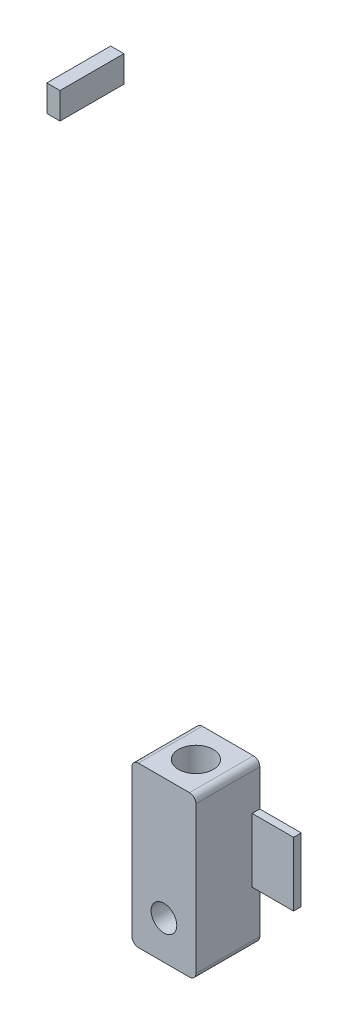
ISO-10303-21;
HEADER;
FILE_DESCRIPTION(('STEP AP214'),'2;1');
FILE_NAME('part.step','',(''),(''),'','','');
FILE_SCHEMA(('AUTOMOTIVE_DESIGN { 1 0 10303 214 1 1 1 1 }'));
ENDSEC;
DATA;
#1=APPLICATION_CONTEXT('core data for automotive mechanical design processes');
#2=APPLICATION_PROTOCOL_DEFINITION('international standard','automotive_design',2000,#1);
#3=PRODUCT_CONTEXT('',#1,'mechanical');
#4=PRODUCT('Part','Part','',(#3));
#5=PRODUCT_RELATED_PRODUCT_CATEGORY('part','',(#4));
#6=PRODUCT_DEFINITION_FORMATION('','',#4);
#7=PRODUCT_DEFINITION_CONTEXT('part definition',#1,'design');
#8=PRODUCT_DEFINITION('design','',#6,#7);
#9=PRODUCT_DEFINITION_SHAPE('','',#8);
#10=(LENGTH_UNIT() NAMED_UNIT(*) SI_UNIT(.MILLI.,.METRE.));
#11=(NAMED_UNIT(*) PLANE_ANGLE_UNIT() SI_UNIT($,.RADIAN.));
#12=(NAMED_UNIT(*) SI_UNIT($,.STERADIAN.) SOLID_ANGLE_UNIT());
#13=UNCERTAINTY_MEASURE_WITH_UNIT(LENGTH_MEASURE(1.E-05),#10,'distance_accuracy_value','');
#14=(GEOMETRIC_REPRESENTATION_CONTEXT(3) GLOBAL_UNCERTAINTY_ASSIGNED_CONTEXT((#13)) GLOBAL_UNIT_ASSIGNED_CONTEXT((#10,
#11,#12)) REPRESENTATION_CONTEXT('',''));
#15=CARTESIAN_POINT('',(0.,0.,0.));
#16=DIRECTION('',(0.,0.,1.));
#17=DIRECTION('',(1.,0.,0.));
#18=AXIS2_PLACEMENT_3D('',#15,#16,#17);
#19=CARTESIAN_POINT('',(-23.2833333333333,123.825,12.2306060509148));
#20=DIRECTION('',(-1.,0.,0.));
#21=DIRECTION('',(0.,-1.,0.));
#22=AXIS2_PLACEMENT_3D('',#19,#20,#21);
#23=PLANE('',#22);
#24=DIRECTION('',(0.,-1.,0.));
#25=VECTOR('',#24,1.);
#26=CARTESIAN_POINT('',(-23.2833333333333,123.825,6.35));
#27=LINE('',#26,#25);
#28=CARTESIAN_POINT('',(-23.2833333333333,123.825,6.35));
#29=VERTEX_POINT('',#28);
#30=CARTESIAN_POINT('',(-23.2833333333333,118.565226048503,6.35));
#31=VERTEX_POINT('',#30);
#32=EDGE_CURVE('E57',#29,#31,#27,.T.);
#33=ORIENTED_EDGE('',*,*,#32,.F.);
#34=DIRECTION('',(0.,0.,-1.));
#35=VECTOR('',#34,1.);
#36=CARTESIAN_POINT('',(-23.2833333333333,123.825,12.2306060509148));
#37=LINE('',#36,#35);
#38=CARTESIAN_POINT('',(-23.2833333333333,123.825,-6.35));
#39=VERTEX_POINT('',#38);
#40=EDGE_CURVE('E85',#29,#39,#37,.T.);
#41=ORIENTED_EDGE('',*,*,#40,.T.);
#42=DIRECTION('',(0.,1.,0.));
#43=VECTOR('',#42,1.);
#44=CARTESIAN_POINT('',(-23.2833333333333,123.825,-6.35));
#45=LINE('',#44,#43);
#46=CARTESIAN_POINT('',(-23.2833333333333,118.565226048503,-6.35));
#47=VERTEX_POINT('',#46);
#48=EDGE_CURVE('E89',#47,#39,#45,.T.);
#49=ORIENTED_EDGE('',*,*,#48,.F.);
#50=DIRECTION('',(0.,0.,-1.));
#51=VECTOR('',#50,1.);
#52=CARTESIAN_POINT('',(-23.2833333333333,118.565226048503,12.2306060509148));
#53=LINE('',#52,#51);
#54=EDGE_CURVE('E111',#31,#47,#53,.T.);
#55=ORIENTED_EDGE('',*,*,#54,.F.);
#56=EDGE_LOOP('',(#33,#41,#49,#55));
#57=FACE_BOUND('',#56,.T.);
#58=ADVANCED_FACE('F49',(#57),#23,.T.);
#59=CARTESIAN_POINT('',(-23.2833333333333,118.565226048503,12.2306060509148));
#60=DIRECTION('',(0.,-1.,0.));
#61=DIRECTION('',(1.,0.,0.));
#62=AXIS2_PLACEMENT_3D('',#59,#60,#61);
#63=PLANE('',#62);
#64=DIRECTION('',(1.,0.,0.));
#65=VECTOR('',#64,1.);
#66=CARTESIAN_POINT('',(-23.2833333333333,118.565226048503,6.35));
#67=LINE('',#66,#65);
#68=CARTESIAN_POINT('',(-20.6534463575849,118.565226048503,6.35));
#69=VERTEX_POINT('',#68);
#70=EDGE_CURVE('E63',#31,#69,#67,.T.);
#71=ORIENTED_EDGE('',*,*,#70,.F.);
#72=ORIENTED_EDGE('',*,*,#54,.T.);
#73=DIRECTION('',(-1.,0.,0.));
#74=VECTOR('',#73,1.);
#75=CARTESIAN_POINT('',(-23.2833333333333,118.565226048503,-6.35));
#76=LINE('',#75,#74);
#77=CARTESIAN_POINT('',(-20.6534463575849,118.565226048503,-6.35));
#78=VERTEX_POINT('',#77);
#79=EDGE_CURVE('E94',#78,#47,#76,.T.);
#80=ORIENTED_EDGE('',*,*,#79,.F.);
#81=DIRECTION('',(0.,0.,-1.));
#82=VECTOR('',#81,1.);
#83=CARTESIAN_POINT('',(-20.6534463575849,118.565226048503,12.2306060509148));
#84=LINE('',#83,#82);
#85=EDGE_CURVE('E114',#69,#78,#84,.T.);
#86=ORIENTED_EDGE('',*,*,#85,.F.);
#87=EDGE_LOOP('',(#71,#72,#80,#86));
#88=FACE_BOUND('',#87,.T.);
#89=ADVANCED_FACE('F120',(#88),#63,.T.);
#90=CARTESIAN_POINT('',(-20.6534463575849,123.825,12.2306060509148));
#91=DIRECTION('',(1.,0.,0.));
#92=DIRECTION('',(0.,0.,-1.));
#93=AXIS2_PLACEMENT_3D('',#90,#91,#92);
#94=PLANE('',#93);
#95=DIRECTION('',(0.,1.,0.));
#96=VECTOR('',#95,1.);
#97=CARTESIAN_POINT('',(-20.6534463575849,123.825,6.35));
#98=LINE('',#97,#96);
#99=CARTESIAN_POINT('',(-20.6534463575849,123.825,6.35));
#100=VERTEX_POINT('',#99);
#101=EDGE_CURVE('E113',#69,#100,#98,.T.);
#102=ORIENTED_EDGE('',*,*,#101,.F.);
#103=ORIENTED_EDGE('',*,*,#85,.T.);
#104=DIRECTION('',(0.,-1.,0.));
#105=VECTOR('',#104,1.);
#106=CARTESIAN_POINT('',(-20.6534463575849,123.825,-6.35));
#107=LINE('',#106,#105);
#108=CARTESIAN_POINT('',(-20.6534463575849,123.825,-6.35));
#109=VERTEX_POINT('',#108);
#110=EDGE_CURVE('E102',#109,#78,#107,.T.);
#111=ORIENTED_EDGE('',*,*,#110,.F.);
#112=DIRECTION('',(0.,0.,-1.));
#113=VECTOR('',#112,1.);
#114=CARTESIAN_POINT('',(-20.6534463575849,123.825,12.2306060509148));
#115=LINE('',#114,#113);
#116=EDGE_CURVE('E93',#100,#109,#115,.T.);
#117=ORIENTED_EDGE('',*,*,#116,.F.);
#118=EDGE_LOOP('',(#102,#103,#111,#117));
#119=FACE_BOUND('',#118,.T.);
#120=ADVANCED_FACE('F118',(#119),#94,.T.);
#121=CARTESIAN_POINT('',(-23.2833333333333,123.825,12.2306060509148));
#122=DIRECTION('',(0.,1.,0.));
#123=DIRECTION('',(0.,0.,1.));
#124=AXIS2_PLACEMENT_3D('',#121,#122,#123);
#125=PLANE('',#124);
#126=DIRECTION('',(-1.,0.,0.));
#127=VECTOR('',#126,1.);
#128=CARTESIAN_POINT('',(-23.2833333333333,123.825,6.35));
#129=LINE('',#128,#127);
#130=EDGE_CURVE('E13',#100,#29,#129,.T.);
#131=ORIENTED_EDGE('',*,*,#130,.F.);
#132=ORIENTED_EDGE('',*,*,#116,.T.);
#133=DIRECTION('',(1.,0.,0.));
#134=VECTOR('',#133,1.);
#135=CARTESIAN_POINT('',(-23.2833333333333,123.825,-6.35));
#136=LINE('',#135,#134);
#137=EDGE_CURVE('E96',#39,#109,#136,.T.);
#138=ORIENTED_EDGE('',*,*,#137,.F.);
#139=ORIENTED_EDGE('',*,*,#40,.F.);
#140=EDGE_LOOP('',(#131,#132,#138,#139));
#141=FACE_BOUND('',#140,.T.);
#142=ADVANCED_FACE('F97',(#141),#125,.T.);
#143=CARTESIAN_POINT('',(0.,0.,-6.35));
#144=DIRECTION('',(0.,0.,1.));
#145=DIRECTION('',(1.,0.,0.));
#146=AXIS2_PLACEMENT_3D('',#143,#144,#145);
#147=PLANE('',#146);
#148=ORIENTED_EDGE('',*,*,#48,.T.);
#149=ORIENTED_EDGE('',*,*,#137,.T.);
#150=ORIENTED_EDGE('',*,*,#110,.T.);
#151=ORIENTED_EDGE('',*,*,#79,.T.);
#152=EDGE_LOOP('',(#148,#149,#150,#151));
#153=FACE_BOUND('',#152,.T.);
#154=ADVANCED_FACE('F104',(#153),#147,.F.);
#155=CARTESIAN_POINT('',(6.35,-15.875,6.35));
#156=DIRECTION('',(0.,0.,-1.));
#157=DIRECTION('',(-1.,0.,0.));
#158=AXIS2_PLACEMENT_3D('',#155,#156,#157);
#159=PLANE('',#158);
#160=ORIENTED_EDGE('',*,*,#32,.T.);
#161=ORIENTED_EDGE('',*,*,#70,.T.);
#162=ORIENTED_EDGE('',*,*,#101,.T.);
#163=ORIENTED_EDGE('',*,*,#130,.T.);
#164=EDGE_LOOP('',(#160,#161,#162,#163));
#165=FACE_BOUND('',#164,.T.);
#166=ADVANCED_FACE('F123',(#165),#159,.F.);
#167=CLOSED_SHELL('',(#58,#89,#120,#142,#154,#166));
#168=MANIFOLD_SOLID_BREP('B2',#167);
#169=CARTESIAN_POINT('',(6.35,0.,0.));
#170=DIRECTION('',(-1.,0.,0.));
#171=DIRECTION('',(0.,0.,1.));
#172=AXIS2_PLACEMENT_3D('',#169,#170,#171);
#173=PLANE('',#172);
#174=DIRECTION('',(0.,1.,0.));
#175=VECTOR('',#174,1.);
#176=CARTESIAN_POINT('',(6.35,-15.875,-6.35));
#177=LINE('',#176,#175);
#178=CARTESIAN_POINT('',(6.35,7.34826693936459,-6.35));
#179=VERTEX_POINT('',#178);
#180=CARTESIAN_POINT('',(6.35,14.605,-6.35));
#181=VERTEX_POINT('',#180);
#182=EDGE_CURVE('E368',#179,#181,#177,.T.);
#183=ORIENTED_EDGE('',*,*,#182,.T.);
#184=DIRECTION('',(0.,0.,1.));
#185=VECTOR('',#184,1.);
#186=CARTESIAN_POINT('',(6.35,14.605,0.));
#187=LINE('',#186,#185);
#188=CARTESIAN_POINT('',(6.35,14.605,6.35));
#189=VERTEX_POINT('',#188);
#190=EDGE_CURVE('E393',#181,#189,#187,.T.);
#191=ORIENTED_EDGE('',*,*,#190,.T.);
#192=DIRECTION('',(0.,-1.,0.));
#193=VECTOR('',#192,1.);
#194=CARTESIAN_POINT('',(6.35,-15.875,6.35));
#195=LINE('',#194,#193);
#196=CARTESIAN_POINT('',(6.35,-14.605,6.35));
#197=VERTEX_POINT('',#196);
#198=EDGE_CURVE('E367',#189,#197,#195,.T.);
#199=ORIENTED_EDGE('',*,*,#198,.T.);
#200=DIRECTION('',(0.,0.,-1.));
#201=VECTOR('',#200,1.);
#202=CARTESIAN_POINT('',(6.35,-14.605,0.));
#203=LINE('',#202,#201);
#204=CARTESIAN_POINT('',(6.35,-14.605,-6.35));
#205=VERTEX_POINT('',#204);
#206=EDGE_CURVE('E389',#197,#205,#203,.T.);
#207=ORIENTED_EDGE('',*,*,#206,.T.);
#208=CARTESIAN_POINT('',(6.35,-5.35173306063541,-6.35));
#209=VERTEX_POINT('',#208);
#210=EDGE_CURVE('E315',#205,#209,#177,.T.);
#211=ORIENTED_EDGE('',*,*,#210,.T.);
#212=DIRECTION('',(0.,0.,-1.));
#213=VECTOR('',#212,1.);
#214=CARTESIAN_POINT('',(6.35,-5.35173306063541,-4.826));
#215=LINE('',#214,#213);
#216=CARTESIAN_POINT('',(6.35,-5.35173306063541,-4.826));
#217=VERTEX_POINT('',#216);
#218=EDGE_CURVE('E308',#217,#209,#215,.T.);
#219=ORIENTED_EDGE('',*,*,#218,.F.);
#220=DIRECTION('',(0.,1.,0.));
#221=VECTOR('',#220,1.);
#222=CARTESIAN_POINT('',(6.35,-5.35173306063541,-4.826));
#223=LINE('',#222,#221);
#224=CARTESIAN_POINT('',(6.35,7.34826693936459,-4.826));
#225=VERTEX_POINT('',#224);
#226=EDGE_CURVE('E292',#217,#225,#223,.T.);
#227=ORIENTED_EDGE('',*,*,#226,.T.);
#228=DIRECTION('',(0.,0.,-1.));
#229=VECTOR('',#228,1.);
#230=CARTESIAN_POINT('',(6.35,7.34826693936459,-4.826));
#231=LINE('',#230,#229);
#232=EDGE_CURVE('E316',#225,#179,#231,.T.);
#233=ORIENTED_EDGE('',*,*,#232,.T.);
#234=EDGE_LOOP('',(#183,#191,#199,#207,#211,#219,#227,#233));
#235=FACE_BOUND('',#234,.T.);
#236=ADVANCED_FACE('F174',(#235),#173,.F.);
#237=CARTESIAN_POINT('',(6.35,-15.875,-6.35));
#238=DIRECTION('',(0.,0.,1.));
#239=DIRECTION('',(1.,0.,0.));
#240=AXIS2_PLACEMENT_3D('',#237,#238,#239);
#241=PLANE('',#240);
#242=CARTESIAN_POINT('',(0.,-8.255,-6.35));
#243=DIRECTION('',(0.,0.,1.));
#244=DIRECTION('',(1.,0.,0.));
#245=AXIS2_PLACEMENT_3D('',#242,#243,#244);
#246=CIRCLE('',#245,2.5527);
#247=CARTESIAN_POINT('',(2.5527,-8.255,-6.35));
#248=VERTEX_POINT('',#247);
#249=EDGE_CURVE('E348',#248,#248,#246,.T.);
#250=ORIENTED_EDGE('',*,*,#249,.T.);
#251=EDGE_LOOP('',(#250));
#252=FACE_BOUND('',#251,.T.);
#253=DIRECTION('',(-1.,0.,0.));
#254=VECTOR('',#253,1.);
#255=CARTESIAN_POINT('',(6.35,15.875,-6.35));
#256=LINE('',#255,#254);
#257=CARTESIAN_POINT('',(5.08,15.875,-6.35));
#258=VERTEX_POINT('',#257);
#259=CARTESIAN_POINT('',(-5.08,15.875,-6.35));
#260=VERTEX_POINT('',#259);
#261=EDGE_CURVE('E386',#258,#260,#256,.T.);
#262=ORIENTED_EDGE('',*,*,#261,.F.);
#263=CARTESIAN_POINT('',(5.08,14.605,-6.35));
#264=DIRECTION('',(0.,0.,1.));
#265=DIRECTION('',(1.,0.,0.));
#266=AXIS2_PLACEMENT_3D('',#263,#264,#265);
#267=CIRCLE('',#266,1.27);
#268=EDGE_CURVE('E413',#258,#181,#267,.F.);
#269=ORIENTED_EDGE('',*,*,#268,.T.);
#270=ORIENTED_EDGE('',*,*,#182,.F.);
#271=DIRECTION('',(1.,0.,0.));
#272=VECTOR('',#271,1.);
#273=CARTESIAN_POINT('',(6.35,7.34826693936459,-6.35));
#274=LINE('',#273,#272);
#275=CARTESIAN_POINT('',(14.5825135513178,7.34826693936459,-6.35));
#276=VERTEX_POINT('',#275);
#277=EDGE_CURVE('E435',#179,#276,#274,.T.);
#278=ORIENTED_EDGE('',*,*,#277,.T.);
#279=DIRECTION('',(0.,-1.,0.));
#280=VECTOR('',#279,1.);
#281=CARTESIAN_POINT('',(14.5825135513178,-5.35173306063541,-6.35));
#282=LINE('',#281,#280);
#283=CARTESIAN_POINT('',(14.5825135513178,-5.35173306063541,-6.35));
#284=VERTEX_POINT('',#283);
#285=EDGE_CURVE('E311',#276,#284,#282,.T.);
#286=ORIENTED_EDGE('',*,*,#285,.T.);
#287=DIRECTION('',(-1.,0.,0.));
#288=VECTOR('',#287,1.);
#289=CARTESIAN_POINT('',(6.35,-5.35173306063541,-6.35));
#290=LINE('',#289,#288);
#291=EDGE_CURVE('E432',#284,#209,#290,.T.);
#292=ORIENTED_EDGE('',*,*,#291,.T.);
#293=ORIENTED_EDGE('',*,*,#210,.F.);
#294=CARTESIAN_POINT('',(5.08,-14.605,-6.35));
#295=DIRECTION('',(0.,0.,1.));
#296=DIRECTION('',(1.,0.,0.));
#297=AXIS2_PLACEMENT_3D('',#294,#295,#296);
#298=CIRCLE('',#297,1.27);
#299=CARTESIAN_POINT('',(5.08,-15.875,-6.35));
#300=VERTEX_POINT('',#299);
#301=EDGE_CURVE('E196',#205,#300,#298,.F.);
#302=ORIENTED_EDGE('',*,*,#301,.T.);
#303=DIRECTION('',(-1.,0.,0.));
#304=VECTOR('',#303,1.);
#305=CARTESIAN_POINT('',(6.35,-15.875,-6.35));
#306=LINE('',#305,#304);
#307=CARTESIAN_POINT('',(-5.08,-15.875,-6.35));
#308=VERTEX_POINT('',#307);
#309=EDGE_CURVE('E372',#300,#308,#306,.T.);
#310=ORIENTED_EDGE('',*,*,#309,.T.);
#311=CARTESIAN_POINT('',(-5.08,-14.605,-6.35));
#312=DIRECTION('',(0.,0.,1.));
#313=DIRECTION('',(1.,0.,0.));
#314=AXIS2_PLACEMENT_3D('',#311,#312,#313);
#315=CIRCLE('',#314,1.27);
#316=CARTESIAN_POINT('',(-6.35,-14.605,-6.35));
#317=VERTEX_POINT('',#316);
#318=EDGE_CURVE('E189',#308,#317,#315,.F.);
#319=ORIENTED_EDGE('',*,*,#318,.T.);
#320=DIRECTION('',(0.,1.,0.));
#321=VECTOR('',#320,1.);
#322=CARTESIAN_POINT('',(-6.35,-15.875,-6.35));
#323=LINE('',#322,#321);
#324=CARTESIAN_POINT('',(-6.35,-5.35173306063541,-6.35));
#325=VERTEX_POINT('',#324);
#326=EDGE_CURVE('E373',#317,#325,#323,.T.);
#327=ORIENTED_EDGE('',*,*,#326,.T.);
#328=DIRECTION('',(-1.,0.,0.));
#329=VECTOR('',#328,1.);
#330=CARTESIAN_POINT('',(-6.35,-5.35173306063541,-6.35));
#331=LINE('',#330,#329);
#332=CARTESIAN_POINT('',(-13.1409122905097,-5.3517330606354,-6.35));
#333=VERTEX_POINT('',#332);
#334=EDGE_CURVE('E341',#325,#333,#331,.T.);
#335=ORIENTED_EDGE('',*,*,#334,.T.);
#336=DIRECTION('',(0.,1.,0.));
#337=VECTOR('',#336,1.);
#338=CARTESIAN_POINT('',(-13.1409122905097,7.3482669393646,-6.35));
#339=LINE('',#338,#337);
#340=CARTESIAN_POINT('',(-13.1409122905097,7.3482669393646,-6.35));
#341=VERTEX_POINT('',#340);
#342=EDGE_CURVE('E328',#333,#341,#339,.T.);
#343=ORIENTED_EDGE('',*,*,#342,.T.);
#344=DIRECTION('',(1.,0.,0.));
#345=VECTOR('',#344,1.);
#346=CARTESIAN_POINT('',(-6.35,7.3482669393646,-6.35));
#347=LINE('',#346,#345);
#348=CARTESIAN_POINT('',(-6.35,7.3482669393646,-6.35));
#349=VERTEX_POINT('',#348);
#350=EDGE_CURVE('E338',#341,#349,#347,.T.);
#351=ORIENTED_EDGE('',*,*,#350,.T.);
#352=CARTESIAN_POINT('',(-6.35,14.605,-6.35));
#353=VERTEX_POINT('',#352);
#354=EDGE_CURVE('E364',#349,#353,#323,.T.);
#355=ORIENTED_EDGE('',*,*,#354,.T.);
#356=CARTESIAN_POINT('',(-5.08,14.605,-6.35));
#357=DIRECTION('',(0.,0.,1.));
#358=DIRECTION('',(1.,0.,0.));
#359=AXIS2_PLACEMENT_3D('',#356,#357,#358);
#360=CIRCLE('',#359,1.27);
#361=EDGE_CURVE('E411',#353,#260,#360,.F.);
#362=ORIENTED_EDGE('',*,*,#361,.T.);
#363=EDGE_LOOP('',(#262,#269,#270,#278,#286,#292,#293,#302,#310,#319,#327,#335,#343,#351,#355,#362));
#364=FACE_BOUND('',#363,.T.);
#365=ADVANCED_FACE('F430',(#252,#364),#241,.F.);
#366=CARTESIAN_POINT('',(6.35,15.875,6.35));
#367=DIRECTION('',(0.,-1.,0.));
#368=DIRECTION('',(0.,0.,-1.));
#369=AXIS2_PLACEMENT_3D('',#366,#367,#368);
#370=PLANE('',#369);
#371=CARTESIAN_POINT('',(0.,15.875,0.));
#372=DIRECTION('',(0.,1.,0.));
#373=DIRECTION('',(0.,0.,1.));
#374=AXIS2_PLACEMENT_3D('',#371,#372,#373);
#375=CIRCLE('',#374,3.45439999999999);
#376=CARTESIAN_POINT('',(0.,15.875,3.45439999999999));
#377=VERTEX_POINT('',#376);
#378=EDGE_CURVE('E358',#377,#377,#375,.T.);
#379=ORIENTED_EDGE('',*,*,#378,.F.);
#380=EDGE_LOOP('',(#379));
#381=FACE_BOUND('',#380,.T.);
#382=DIRECTION('',(-1.,0.,0.));
#383=VECTOR('',#382,1.);
#384=CARTESIAN_POINT('',(6.35,15.875,6.35));
#385=LINE('',#384,#383);
#386=CARTESIAN_POINT('',(5.08,15.875,6.35));
#387=VERTEX_POINT('',#386);
#388=CARTESIAN_POINT('',(-5.08,15.875,6.35));
#389=VERTEX_POINT('',#388);
#390=EDGE_CURVE('E383',#387,#389,#385,.T.);
#391=ORIENTED_EDGE('',*,*,#390,.F.);
#392=DIRECTION('',(0.,0.,1.));
#393=VECTOR('',#392,1.);
#394=CARTESIAN_POINT('',(5.08,15.875,6.35));
#395=LINE('',#394,#393);
#396=EDGE_CURVE('E407',#387,#258,#395,.F.);
#397=ORIENTED_EDGE('',*,*,#396,.T.);
#398=ORIENTED_EDGE('',*,*,#261,.T.);
#399=DIRECTION('',(0.,0.,1.));
#400=VECTOR('',#399,1.);
#401=CARTESIAN_POINT('',(-5.08,15.875,6.35));
#402=LINE('',#401,#400);
#403=EDGE_CURVE('E404',#260,#389,#402,.T.);
#404=ORIENTED_EDGE('',*,*,#403,.T.);
#405=EDGE_LOOP('',(#391,#397,#398,#404));
#406=FACE_BOUND('',#405,.T.);
#407=ADVANCED_FACE('F461',(#381,#406),#370,.F.);
#408=CARTESIAN_POINT('',(6.35,-15.875,6.35));
#409=DIRECTION('',(0.,0.,-1.));
#410=DIRECTION('',(-1.,0.,0.));
#411=AXIS2_PLACEMENT_3D('',#408,#409,#410);
#412=PLANE('',#411);
#413=CARTESIAN_POINT('',(0.,-8.255,6.35));
#414=DIRECTION('',(0.,0.,-1.));
#415=DIRECTION('',(-1.,0.,0.));
#416=AXIS2_PLACEMENT_3D('',#413,#414,#415);
#417=CIRCLE('',#416,2.5527);
#418=CARTESIAN_POINT('',(-2.5527,-8.255,6.35));
#419=VERTEX_POINT('',#418);
#420=EDGE_CURVE('E357',#419,#419,#417,.T.);
#421=ORIENTED_EDGE('',*,*,#420,.T.);
#422=EDGE_LOOP('',(#421));
#423=FACE_BOUND('',#422,.T.);
#424=ORIENTED_EDGE('',*,*,#198,.F.);
#425=CARTESIAN_POINT('',(5.08,14.605,6.35));
#426=DIRECTION('',(0.,0.,-1.));
#427=DIRECTION('',(-1.,0.,0.));
#428=AXIS2_PLACEMENT_3D('',#425,#426,#427);
#429=CIRCLE('',#428,1.27);
#430=EDGE_CURVE('E402',#189,#387,#429,.F.);
#431=ORIENTED_EDGE('',*,*,#430,.T.);
#432=ORIENTED_EDGE('',*,*,#390,.T.);
#433=CARTESIAN_POINT('',(-5.08,14.605,6.35));
#434=DIRECTION('',(0.,0.,-1.));
#435=DIRECTION('',(-1.,0.,0.));
#436=AXIS2_PLACEMENT_3D('',#433,#434,#435);
#437=CIRCLE('',#436,1.27);
#438=CARTESIAN_POINT('',(-6.35,14.605,6.35));
#439=VERTEX_POINT('',#438);
#440=EDGE_CURVE('E400',#389,#439,#437,.F.);
#441=ORIENTED_EDGE('',*,*,#440,.T.);
#442=DIRECTION('',(0.,-1.,0.));
#443=VECTOR('',#442,1.);
#444=CARTESIAN_POINT('',(-6.35,-15.875,6.35));
#445=LINE('',#444,#443);
#446=CARTESIAN_POINT('',(-6.35,-14.605,6.35));
#447=VERTEX_POINT('',#446);
#448=EDGE_CURVE('E376',#439,#447,#445,.T.);
#449=ORIENTED_EDGE('',*,*,#448,.T.);
#450=CARTESIAN_POINT('',(-5.08,-14.605,6.35));
#451=DIRECTION('',(0.,0.,-1.));
#452=DIRECTION('',(-1.,0.,0.));
#453=AXIS2_PLACEMENT_3D('',#450,#451,#452);
#454=CIRCLE('',#453,1.27);
#455=CARTESIAN_POINT('',(-5.08,-15.875,6.35));
#456=VERTEX_POINT('',#455);
#457=EDGE_CURVE('E398',#447,#456,#454,.F.);
#458=ORIENTED_EDGE('',*,*,#457,.T.);
#459=DIRECTION('',(-1.,0.,0.));
#460=VECTOR('',#459,1.);
#461=CARTESIAN_POINT('',(6.35,-15.875,6.35));
#462=LINE('',#461,#460);
#463=CARTESIAN_POINT('',(5.08,-15.875,6.35));
#464=VERTEX_POINT('',#463);
#465=EDGE_CURVE('E380',#464,#456,#462,.T.);
#466=ORIENTED_EDGE('',*,*,#465,.F.);
#467=CARTESIAN_POINT('',(5.08,-14.605,6.35));
#468=DIRECTION('',(0.,0.,-1.));
#469=DIRECTION('',(-1.,0.,0.));
#470=AXIS2_PLACEMENT_3D('',#467,#468,#469);
#471=CIRCLE('',#470,1.27);
#472=EDGE_CURVE('E396',#464,#197,#471,.F.);
#473=ORIENTED_EDGE('',*,*,#472,.T.);
#474=EDGE_LOOP('',(#424,#431,#432,#441,#449,#458,#466,#473));
#475=FACE_BOUND('',#474,.T.);
#476=ADVANCED_FACE('F426',(#423,#475),#412,.F.);
#477=CARTESIAN_POINT('',(6.35,-15.875,6.35));
#478=DIRECTION('',(0.,1.,0.));
#479=DIRECTION('',(0.,0.,1.));
#480=AXIS2_PLACEMENT_3D('',#477,#478,#479);
#481=PLANE('',#480);
#482=ORIENTED_EDGE('',*,*,#465,.T.);
#483=DIRECTION('',(0.,0.,-1.));
#484=VECTOR('',#483,1.);
#485=CARTESIAN_POINT('',(-5.08,-15.875,-6.35));
#486=LINE('',#485,#484);
#487=EDGE_CURVE('E47',#456,#308,#486,.T.);
#488=ORIENTED_EDGE('',*,*,#487,.T.);
#489=ORIENTED_EDGE('',*,*,#309,.F.);
#490=DIRECTION('',(0.,0.,-1.));
#491=VECTOR('',#490,1.);
#492=CARTESIAN_POINT('',(5.08,-15.875,6.35));
#493=LINE('',#492,#491);
#494=EDGE_CURVE('E182',#300,#464,#493,.F.);
#495=ORIENTED_EDGE('',*,*,#494,.T.);
#496=EDGE_LOOP('',(#482,#488,#489,#495));
#497=FACE_BOUND('',#496,.T.);
#498=ADVANCED_FACE('F421',(#497),#481,.F.);
#499=CARTESIAN_POINT('',(-6.35,0.,0.));
#500=DIRECTION('',(-1.,0.,0.));
#501=DIRECTION('',(0.,0.,1.));
#502=AXIS2_PLACEMENT_3D('',#499,#500,#501);
#503=PLANE('',#502);
#504=ORIENTED_EDGE('',*,*,#448,.F.);
#505=DIRECTION('',(0.,0.,1.));
#506=VECTOR('',#505,1.);
#507=CARTESIAN_POINT('',(-6.35,14.605,-6.35));
#508=LINE('',#507,#506);
#509=EDGE_CURVE('E417',#439,#353,#508,.F.);
#510=ORIENTED_EDGE('',*,*,#509,.T.);
#511=ORIENTED_EDGE('',*,*,#354,.F.);
#512=DIRECTION('',(0.,0.,-1.));
#513=VECTOR('',#512,1.);
#514=CARTESIAN_POINT('',(-6.35,7.3482669393646,-4.826));
#515=LINE('',#514,#513);
#516=CARTESIAN_POINT('',(-6.35,7.3482669393646,-4.826));
#517=VERTEX_POINT('',#516);
#518=EDGE_CURVE('E337',#517,#349,#515,.T.);
#519=ORIENTED_EDGE('',*,*,#518,.F.);
#520=DIRECTION('',(0.,-1.,0.));
#521=VECTOR('',#520,1.);
#522=CARTESIAN_POINT('',(-6.35,7.3482669393646,-4.826));
#523=LINE('',#522,#521);
#524=CARTESIAN_POINT('',(-6.35,-5.35173306063541,-4.826));
#525=VERTEX_POINT('',#524);
#526=EDGE_CURVE('E327',#517,#525,#523,.T.);
#527=ORIENTED_EDGE('',*,*,#526,.T.);
#528=DIRECTION('',(0.,0.,-1.));
#529=VECTOR('',#528,1.);
#530=CARTESIAN_POINT('',(-6.35,-5.35173306063541,-4.826));
#531=LINE('',#530,#529);
#532=EDGE_CURVE('E351',#525,#325,#531,.T.);
#533=ORIENTED_EDGE('',*,*,#532,.T.);
#534=ORIENTED_EDGE('',*,*,#326,.F.);
#535=DIRECTION('',(0.,0.,-1.));
#536=VECTOR('',#535,1.);
#537=CARTESIAN_POINT('',(-6.35,-14.605,6.35));
#538=LINE('',#537,#536);
#539=EDGE_CURVE('E415',#317,#447,#538,.F.);
#540=ORIENTED_EDGE('',*,*,#539,.T.);
#541=EDGE_LOOP('',(#504,#510,#511,#519,#527,#533,#534,#540));
#542=FACE_BOUND('',#541,.T.);
#543=ADVANCED_FACE('F468',(#542),#503,.T.);
#544=CARTESIAN_POINT('',(0.,3.175,0.));
#545=DIRECTION('',(0.,1.,0.));
#546=DIRECTION('',(0.,0.,1.));
#547=AXIS2_PLACEMENT_3D('',#544,#545,#546);
#548=CONICAL_SURFACE('',#547,3.4544,1.02974425867665);
#549=CARTESIAN_POINT('',(0.,1.09938707763119,0.));
#550=VERTEX_POINT('',#549);
#551=VERTEX_LOOP('',#550);
#552=FACE_BOUND('',#551,.T.);
#553=CARTESIAN_POINT('',(0.,3.175,0.));
#554=DIRECTION('',(0.,1.,0.));
#555=DIRECTION('',(0.,0.,1.));
#556=AXIS2_PLACEMENT_3D('',#553,#554,#555);
#557=CIRCLE('',#556,3.4544);
#558=CARTESIAN_POINT('',(0.,3.175,3.4544));
#559=VERTEX_POINT('',#558);
#560=EDGE_CURVE('E361',#559,#559,#557,.T.);
#561=ORIENTED_EDGE('',*,*,#560,.T.);
#562=EDGE_LOOP('',(#561));
#563=FACE_BOUND('',#562,.T.);
#564=ADVANCED_FACE('F466',(#552,#563),#548,.F.);
#565=CARTESIAN_POINT('',(0.,15.875,0.));
#566=DIRECTION('',(0.,1.,0.));
#567=DIRECTION('',(0.,0.,1.));
#568=AXIS2_PLACEMENT_3D('',#565,#566,#567);
#569=CYLINDRICAL_SURFACE('',#568,3.45439999999999);
#570=ORIENTED_EDGE('',*,*,#560,.F.);
#571=EDGE_LOOP('',(#570));
#572=FACE_BOUND('',#571,.T.);
#573=ORIENTED_EDGE('',*,*,#378,.T.);
#574=EDGE_LOOP('',(#573));
#575=FACE_BOUND('',#574,.T.);
#576=ADVANCED_FACE('F526',(#572,#575),#569,.F.);
#577=CARTESIAN_POINT('',(0.,-8.255,-6.35));
#578=DIRECTION('',(0.,0.,1.));
#579=DIRECTION('',(1.,0.,0.));
#580=AXIS2_PLACEMENT_3D('',#577,#578,#579);
#581=CYLINDRICAL_SURFACE('',#580,2.5527);
#582=ORIENTED_EDGE('',*,*,#249,.F.);
#583=EDGE_LOOP('',(#582));
#584=FACE_BOUND('',#583,.T.);
#585=ORIENTED_EDGE('',*,*,#420,.F.);
#586=EDGE_LOOP('',(#585));
#587=FACE_BOUND('',#586,.T.);
#588=ADVANCED_FACE('F519',(#584,#587),#581,.F.);
#589=CARTESIAN_POINT('',(-6.35,7.3482669393646,-4.826));
#590=DIRECTION('',(0.,1.,0.));
#591=DIRECTION('',(-1.,0.,0.));
#592=AXIS2_PLACEMENT_3D('',#589,#590,#591);
#593=PLANE('',#592);
#594=ORIENTED_EDGE('',*,*,#350,.F.);
#595=DIRECTION('',(0.,0.,-1.));
#596=VECTOR('',#595,1.);
#597=CARTESIAN_POINT('',(-13.1409122905097,7.3482669393646,-4.826));
#598=LINE('',#597,#596);
#599=CARTESIAN_POINT('',(-13.1409122905097,7.3482669393646,-4.826));
#600=VERTEX_POINT('',#599);
#601=EDGE_CURVE('E346',#600,#341,#598,.T.);
#602=ORIENTED_EDGE('',*,*,#601,.F.);
#603=DIRECTION('',(1.,0.,0.));
#604=VECTOR('',#603,1.);
#605=CARTESIAN_POINT('',(-6.35,7.3482669393646,-4.826));
#606=LINE('',#605,#604);
#607=EDGE_CURVE('E324',#600,#517,#606,.T.);
#608=ORIENTED_EDGE('',*,*,#607,.T.);
#609=ORIENTED_EDGE('',*,*,#518,.T.);
#610=EDGE_LOOP('',(#594,#602,#608,#609));
#611=FACE_BOUND('',#610,.T.);
#612=ADVANCED_FACE('F517',(#611),#593,.T.);
#613=CARTESIAN_POINT('',(-13.1409122905097,7.3482669393646,-4.826));
#614=DIRECTION('',(-1.,0.,0.));
#615=DIRECTION('',(0.,-1.,0.));
#616=AXIS2_PLACEMENT_3D('',#613,#614,#615);
#617=PLANE('',#616);
#618=ORIENTED_EDGE('',*,*,#342,.F.);
#619=DIRECTION('',(0.,0.,-1.));
#620=VECTOR('',#619,1.);
#621=CARTESIAN_POINT('',(-13.1409122905097,-5.3517330606354,-4.826));
#622=LINE('',#621,#620);
#623=CARTESIAN_POINT('',(-13.1409122905097,-5.3517330606354,-4.826));
#624=VERTEX_POINT('',#623);
#625=EDGE_CURVE('E349',#624,#333,#622,.T.);
#626=ORIENTED_EDGE('',*,*,#625,.F.);
#627=DIRECTION('',(0.,1.,0.));
#628=VECTOR('',#627,1.);
#629=CARTESIAN_POINT('',(-13.1409122905097,7.3482669393646,-4.826));
#630=LINE('',#629,#628);
#631=EDGE_CURVE('E334',#624,#600,#630,.T.);
#632=ORIENTED_EDGE('',*,*,#631,.T.);
#633=ORIENTED_EDGE('',*,*,#601,.T.);
#634=EDGE_LOOP('',(#618,#626,#632,#633));
#635=FACE_BOUND('',#634,.T.);
#636=ADVANCED_FACE('F504',(#635),#617,.T.);
#637=CARTESIAN_POINT('',(-6.35,-5.35173306063541,-4.826));
#638=DIRECTION('',(0.,-1.,0.));
#639=DIRECTION('',(1.,0.,0.));
#640=AXIS2_PLACEMENT_3D('',#637,#638,#639);
#641=PLANE('',#640);
#642=ORIENTED_EDGE('',*,*,#334,.F.);
#643=ORIENTED_EDGE('',*,*,#532,.F.);
#644=DIRECTION('',(-1.,0.,0.));
#645=VECTOR('',#644,1.);
#646=CARTESIAN_POINT('',(-6.35,-5.35173306063541,-4.826));
#647=LINE('',#646,#645);
#648=EDGE_CURVE('E331',#525,#624,#647,.T.);
#649=ORIENTED_EDGE('',*,*,#648,.T.);
#650=ORIENTED_EDGE('',*,*,#625,.T.);
#651=EDGE_LOOP('',(#642,#643,#649,#650));
#652=FACE_BOUND('',#651,.T.);
#653=ADVANCED_FACE('F498',(#652),#641,.T.);
#654=CARTESIAN_POINT('',(0.,0.,-4.826));
#655=DIRECTION('',(0.,0.,1.));
#656=DIRECTION('',(1.,0.,0.));
#657=AXIS2_PLACEMENT_3D('',#654,#655,#656);
#658=PLANE('',#657);
#659=ORIENTED_EDGE('',*,*,#607,.F.);
#660=ORIENTED_EDGE('',*,*,#631,.F.);
#661=ORIENTED_EDGE('',*,*,#648,.F.);
#662=ORIENTED_EDGE('',*,*,#526,.F.);
#663=EDGE_LOOP('',(#659,#660,#661,#662));
#664=FACE_BOUND('',#663,.T.);
#665=ADVANCED_FACE('F453',(#664),#658,.T.);
#666=CARTESIAN_POINT('',(6.35,-5.35173306063541,-4.826));
#667=DIRECTION('',(0.,-1.,0.));
#668=DIRECTION('',(0.,0.,-1.));
#669=AXIS2_PLACEMENT_3D('',#666,#667,#668);
#670=PLANE('',#669);
#671=ORIENTED_EDGE('',*,*,#291,.F.);
#672=DIRECTION('',(0.,0.,-1.));
#673=VECTOR('',#672,1.);
#674=CARTESIAN_POINT('',(14.5825135513178,-5.35173306063541,-4.826));
#675=LINE('',#674,#673);
#676=CARTESIAN_POINT('',(14.5825135513178,-5.35173306063541,-4.826));
#677=VERTEX_POINT('',#676);
#678=EDGE_CURVE('E310',#677,#284,#675,.T.);
#679=ORIENTED_EDGE('',*,*,#678,.F.);
#680=DIRECTION('',(-1.,0.,0.));
#681=VECTOR('',#680,1.);
#682=CARTESIAN_POINT('',(6.35,-5.35173306063541,-4.826));
#683=LINE('',#682,#681);
#684=EDGE_CURVE('E296',#677,#217,#683,.T.);
#685=ORIENTED_EDGE('',*,*,#684,.T.);
#686=ORIENTED_EDGE('',*,*,#218,.T.);
#687=EDGE_LOOP('',(#671,#679,#685,#686));
#688=FACE_BOUND('',#687,.T.);
#689=ADVANCED_FACE('F307',(#688),#670,.T.);
#690=CARTESIAN_POINT('',(14.5825135513178,-5.35173306063541,-4.826));
#691=DIRECTION('',(1.,0.,0.));
#692=DIRECTION('',(0.,0.,-1.));
#693=AXIS2_PLACEMENT_3D('',#690,#691,#692);
#694=PLANE('',#693);
#695=ORIENTED_EDGE('',*,*,#285,.F.);
#696=DIRECTION('',(0.,0.,-1.));
#697=VECTOR('',#696,1.);
#698=CARTESIAN_POINT('',(14.5825135513178,7.34826693936459,-4.826));
#699=LINE('',#698,#697);
#700=CARTESIAN_POINT('',(14.5825135513178,7.34826693936459,-4.826));
#701=VERTEX_POINT('',#700);
#702=EDGE_CURVE('E319',#701,#276,#699,.T.);
#703=ORIENTED_EDGE('',*,*,#702,.F.);
#704=DIRECTION('',(0.,-1.,0.));
#705=VECTOR('',#704,1.);
#706=CARTESIAN_POINT('',(14.5825135513178,-5.35173306063541,-4.826));
#707=LINE('',#706,#705);
#708=EDGE_CURVE('E317',#701,#677,#707,.T.);
#709=ORIENTED_EDGE('',*,*,#708,.T.);
#710=ORIENTED_EDGE('',*,*,#678,.T.);
#711=EDGE_LOOP('',(#695,#703,#709,#710));
#712=FACE_BOUND('',#711,.T.);
#713=ADVANCED_FACE('F445',(#712),#694,.T.);
#714=CARTESIAN_POINT('',(6.35,7.34826693936459,-4.826));
#715=DIRECTION('',(0.,1.,0.));
#716=DIRECTION('',(-1.,0.,0.));
#717=AXIS2_PLACEMENT_3D('',#714,#715,#716);
#718=PLANE('',#717);
#719=ORIENTED_EDGE('',*,*,#277,.F.);
#720=ORIENTED_EDGE('',*,*,#232,.F.);
#721=DIRECTION('',(1.,0.,0.));
#722=VECTOR('',#721,1.);
#723=CARTESIAN_POINT('',(6.35,7.34826693936459,-4.826));
#724=LINE('',#723,#722);
#725=EDGE_CURVE('E299',#225,#701,#724,.T.);
#726=ORIENTED_EDGE('',*,*,#725,.T.);
#727=ORIENTED_EDGE('',*,*,#702,.T.);
#728=EDGE_LOOP('',(#719,#720,#726,#727));
#729=FACE_BOUND('',#728,.T.);
#730=ADVANCED_FACE('F442',(#729),#718,.T.);
#731=CARTESIAN_POINT('',(0.,0.,-4.826));
#732=DIRECTION('',(0.,0.,1.));
#733=DIRECTION('',(1.,0.,0.));
#734=AXIS2_PLACEMENT_3D('',#731,#732,#733);
#735=PLANE('',#734);
#736=ORIENTED_EDGE('',*,*,#684,.F.);
#737=ORIENTED_EDGE('',*,*,#708,.F.);
#738=ORIENTED_EDGE('',*,*,#725,.F.);
#739=ORIENTED_EDGE('',*,*,#226,.F.);
#740=EDGE_LOOP('',(#736,#737,#738,#739));
#741=FACE_BOUND('',#740,.T.);
#742=ADVANCED_FACE('F294',(#741),#735,.T.);
#743=CARTESIAN_POINT('',(5.08,14.605,0.));
#744=DIRECTION('',(0.,0.,1.));
#745=DIRECTION('',(1.,0.,0.));
#746=AXIS2_PLACEMENT_3D('',#743,#744,#745);
#747=CYLINDRICAL_SURFACE('',#746,1.27);
#748=ORIENTED_EDGE('',*,*,#268,.F.);
#749=ORIENTED_EDGE('',*,*,#396,.F.);
#750=ORIENTED_EDGE('',*,*,#430,.F.);
#751=ORIENTED_EDGE('',*,*,#190,.F.);
#752=EDGE_LOOP('',(#748,#749,#750,#751));
#753=FACE_BOUND('',#752,.T.);
#754=ADVANCED_FACE('F480',(#753),#747,.T.);
#755=CARTESIAN_POINT('',(-5.08,14.605,6.35));
#756=DIRECTION('',(0.,0.,-1.));
#757=DIRECTION('',(-1.,0.,0.));
#758=AXIS2_PLACEMENT_3D('',#755,#756,#757);
#759=CYLINDRICAL_SURFACE('',#758,1.27);
#760=ORIENTED_EDGE('',*,*,#361,.F.);
#761=ORIENTED_EDGE('',*,*,#509,.F.);
#762=ORIENTED_EDGE('',*,*,#440,.F.);
#763=ORIENTED_EDGE('',*,*,#403,.F.);
#764=EDGE_LOOP('',(#760,#761,#762,#763));
#765=FACE_BOUND('',#764,.T.);
#766=ADVANCED_FACE('F483',(#765),#759,.T.);
#767=CARTESIAN_POINT('',(-5.08,-14.605,6.35));
#768=DIRECTION('',(0.,0.,1.));
#769=DIRECTION('',(1.,0.,0.));
#770=AXIS2_PLACEMENT_3D('',#767,#768,#769);
#771=CYLINDRICAL_SURFACE('',#770,1.27);
#772=ORIENTED_EDGE('',*,*,#457,.F.);
#773=ORIENTED_EDGE('',*,*,#539,.F.);
#774=ORIENTED_EDGE('',*,*,#318,.F.);
#775=ORIENTED_EDGE('',*,*,#487,.F.);
#776=EDGE_LOOP('',(#772,#773,#774,#775));
#777=FACE_BOUND('',#776,.T.);
#778=ADVANCED_FACE('F486',(#777),#771,.T.);
#779=CARTESIAN_POINT('',(5.08,-14.605,0.));
#780=DIRECTION('',(0.,0.,-1.));
#781=DIRECTION('',(-1.,0.,0.));
#782=AXIS2_PLACEMENT_3D('',#779,#780,#781);
#783=CYLINDRICAL_SURFACE('',#782,1.27);
#784=ORIENTED_EDGE('',*,*,#472,.F.);
#785=ORIENTED_EDGE('',*,*,#494,.F.);
#786=ORIENTED_EDGE('',*,*,#301,.F.);
#787=ORIENTED_EDGE('',*,*,#206,.F.);
#788=EDGE_LOOP('',(#784,#785,#786,#787));
#789=FACE_BOUND('',#788,.T.);
#790=ADVANCED_FACE('F176',(#789),#783,.T.);
#791=CLOSED_SHELL('',(#236,#365,#407,#476,#498,#543,#564,#576,#588,#612,#636,#653,#665,#689,
#713,#730,#742,#754,#766,#778,#790));
#792=MANIFOLD_SOLID_BREP('B7',#791);
#793=ADVANCED_BREP_SHAPE_REPRESENTATION('',(#18,#168,#792),#14);
#794=SHAPE_DEFINITION_REPRESENTATION(#9,#793);
ENDSEC;
END-ISO-10303-21;
